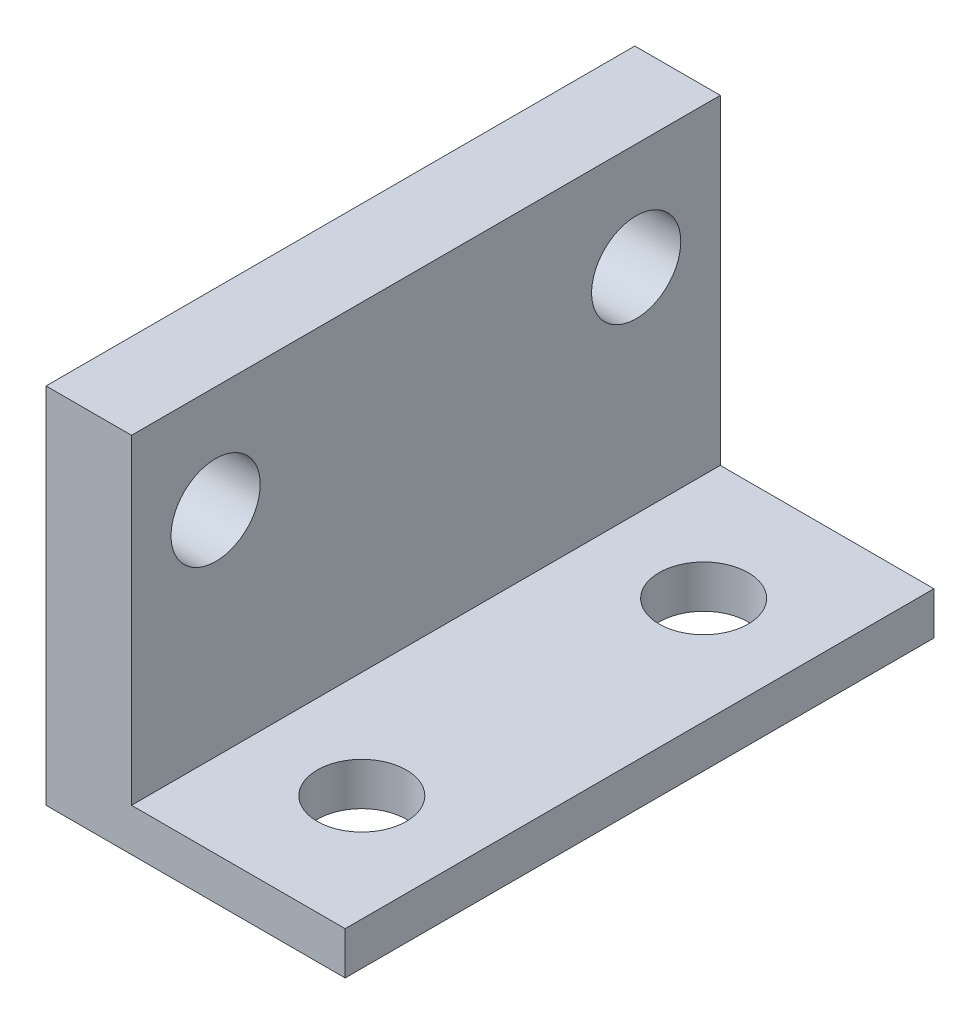
ISO-10303-21;
HEADER;
FILE_DESCRIPTION(('STEP AP214'),'2;1');
FILE_NAME('part.step','',(''),(''),'','','');
FILE_SCHEMA(('AUTOMOTIVE_DESIGN { 1 0 10303 214 1 1 1 1 }'));
ENDSEC;
DATA;
#1=APPLICATION_CONTEXT('core data for automotive mechanical design processes');
#2=APPLICATION_PROTOCOL_DEFINITION('international standard','automotive_design',2000,#1);
#3=PRODUCT_CONTEXT('',#1,'mechanical');
#4=PRODUCT('Part','Part','',(#3));
#5=PRODUCT_RELATED_PRODUCT_CATEGORY('part','',(#4));
#6=PRODUCT_DEFINITION_FORMATION('','',#4);
#7=PRODUCT_DEFINITION_CONTEXT('part definition',#1,'design');
#8=PRODUCT_DEFINITION('design','',#6,#7);
#9=PRODUCT_DEFINITION_SHAPE('','',#8);
#10=(LENGTH_UNIT() NAMED_UNIT(*) SI_UNIT(.MILLI.,.METRE.));
#11=(NAMED_UNIT(*) PLANE_ANGLE_UNIT() SI_UNIT($,.RADIAN.));
#12=(NAMED_UNIT(*) SI_UNIT($,.STERADIAN.) SOLID_ANGLE_UNIT());
#13=UNCERTAINTY_MEASURE_WITH_UNIT(LENGTH_MEASURE(1.E-05),#10,'distance_accuracy_value','');
#14=(GEOMETRIC_REPRESENTATION_CONTEXT(3) GLOBAL_UNCERTAINTY_ASSIGNED_CONTEXT((#13)) GLOBAL_UNIT_ASSIGNED_CONTEXT((#10,
#11,#12)) REPRESENTATION_CONTEXT('',''));
#15=CARTESIAN_POINT('',(0.,0.,0.));
#16=DIRECTION('',(0.,0.,1.));
#17=DIRECTION('',(1.,0.,0.));
#18=AXIS2_PLACEMENT_3D('',#15,#16,#17);
#19=CARTESIAN_POINT('',(0.,0.,35.));
#20=DIRECTION('',(0.,0.,1.));
#21=DIRECTION('',(1.,0.,0.));
#22=AXIS2_PLACEMENT_3D('',#19,#20,#21);
#23=PLANE('',#22);
#24=DIRECTION('',(1.,0.,0.));
#25=VECTOR('',#24,1.);
#26=CARTESIAN_POINT('',(0.,21.59,35.));
#27=LINE('',#26,#25);
#28=CARTESIAN_POINT('',(0.,21.59,35.));
#29=VERTEX_POINT('',#28);
#30=CARTESIAN_POINT('',(5.08,21.59,35.));
#31=VERTEX_POINT('',#30);
#32=EDGE_CURVE('E94',#29,#31,#27,.T.);
#33=ORIENTED_EDGE('',*,*,#32,.F.);
#34=DIRECTION('',(0.,1.,0.));
#35=VECTOR('',#34,1.);
#36=CARTESIAN_POINT('',(0.,2.54,35.));
#37=LINE('',#36,#35);
#38=CARTESIAN_POINT('',(0.,0.,35.));
#39=VERTEX_POINT('',#38);
#40=EDGE_CURVE('E139',#39,#29,#37,.T.);
#41=ORIENTED_EDGE('',*,*,#40,.F.);
#42=DIRECTION('',(1.,0.,0.));
#43=VECTOR('',#42,1.);
#44=CARTESIAN_POINT('',(0.,0.,35.));
#45=LINE('',#44,#43);
#46=CARTESIAN_POINT('',(17.78,0.,35.));
#47=VERTEX_POINT('',#46);
#48=EDGE_CURVE('E98',#39,#47,#45,.T.);
#49=ORIENTED_EDGE('',*,*,#48,.T.);
#50=DIRECTION('',(0.,1.,0.));
#51=VECTOR('',#50,1.);
#52=CARTESIAN_POINT('',(17.78,0.,35.));
#53=LINE('',#52,#51);
#54=CARTESIAN_POINT('',(17.78,2.54,35.));
#55=VERTEX_POINT('',#54);
#56=EDGE_CURVE('E108',#47,#55,#53,.T.);
#57=ORIENTED_EDGE('',*,*,#56,.T.);
#58=DIRECTION('',(1.,0.,0.));
#59=VECTOR('',#58,1.);
#60=CARTESIAN_POINT('',(0.,2.54,35.));
#61=LINE('',#60,#59);
#62=CARTESIAN_POINT('',(5.08,2.54,35.));
#63=VERTEX_POINT('',#62);
#64=EDGE_CURVE('E106',#63,#55,#61,.T.);
#65=ORIENTED_EDGE('',*,*,#64,.F.);
#66=DIRECTION('',(0.,1.,0.));
#67=VECTOR('',#66,1.);
#68=CARTESIAN_POINT('',(5.08,2.54,35.));
#69=LINE('',#68,#67);
#70=EDGE_CURVE('E136',#63,#31,#69,.T.);
#71=ORIENTED_EDGE('',*,*,#70,.T.);
#72=EDGE_LOOP('',(#33,#41,#49,#57,#65,#71));
#73=FACE_BOUND('',#72,.T.);
#74=ADVANCED_FACE('F32',(#73),#23,.T.);
#75=CARTESIAN_POINT('',(0.,21.59,35.));
#76=DIRECTION('',(0.,1.,0.));
#77=DIRECTION('',(0.,0.,1.));
#78=AXIS2_PLACEMENT_3D('',#75,#76,#77);
#79=PLANE('',#78);
#80=DIRECTION('',(1.,0.,0.));
#81=VECTOR('',#80,1.);
#82=CARTESIAN_POINT('',(0.,21.59,0.));
#83=LINE('',#82,#81);
#84=CARTESIAN_POINT('',(0.,21.59,0.));
#85=VERTEX_POINT('',#84);
#86=CARTESIAN_POINT('',(5.08,21.59,0.));
#87=VERTEX_POINT('',#86);
#88=EDGE_CURVE('E99',#85,#87,#83,.T.);
#89=ORIENTED_EDGE('',*,*,#88,.F.);
#90=DIRECTION('',(0.,0.,-1.));
#91=VECTOR('',#90,1.);
#92=CARTESIAN_POINT('',(0.,21.59,35.));
#93=LINE('',#92,#91);
#94=EDGE_CURVE('E11',#29,#85,#93,.T.);
#95=ORIENTED_EDGE('',*,*,#94,.F.);
#96=ORIENTED_EDGE('',*,*,#32,.T.);
#97=DIRECTION('',(0.,0.,-1.));
#98=VECTOR('',#97,1.);
#99=CARTESIAN_POINT('',(5.08,21.59,35.));
#100=LINE('',#99,#98);
#101=EDGE_CURVE('E141',#31,#87,#100,.T.);
#102=ORIENTED_EDGE('',*,*,#101,.T.);
#103=EDGE_LOOP('',(#89,#95,#96,#102));
#104=FACE_BOUND('',#103,.T.);
#105=ADVANCED_FACE('F147',(#104),#79,.T.);
#106=CARTESIAN_POINT('',(0.,0.,0.));
#107=DIRECTION('',(0.,0.,1.));
#108=DIRECTION('',(1.,0.,0.));
#109=AXIS2_PLACEMENT_3D('',#106,#107,#108);
#110=PLANE('',#109);
#111=ORIENTED_EDGE('',*,*,#88,.T.);
#112=DIRECTION('',(0.,1.,0.));
#113=VECTOR('',#112,1.);
#114=CARTESIAN_POINT('',(5.08,2.54,0.));
#115=LINE('',#114,#113);
#116=CARTESIAN_POINT('',(5.08,2.54,0.));
#117=VERTEX_POINT('',#116);
#118=EDGE_CURVE('E95',#117,#87,#115,.T.);
#119=ORIENTED_EDGE('',*,*,#118,.F.);
#120=DIRECTION('',(1.,0.,0.));
#121=VECTOR('',#120,1.);
#122=CARTESIAN_POINT('',(0.,2.54,0.));
#123=LINE('',#122,#121);
#124=CARTESIAN_POINT('',(17.78,2.54,0.));
#125=VERTEX_POINT('',#124);
#126=EDGE_CURVE('E110',#117,#125,#123,.T.);
#127=ORIENTED_EDGE('',*,*,#126,.T.);
#128=DIRECTION('',(0.,1.,0.));
#129=VECTOR('',#128,1.);
#130=CARTESIAN_POINT('',(17.78,0.,0.));
#131=LINE('',#130,#129);
#132=CARTESIAN_POINT('',(17.78,0.,0.));
#133=VERTEX_POINT('',#132);
#134=EDGE_CURVE('E105',#133,#125,#131,.T.);
#135=ORIENTED_EDGE('',*,*,#134,.F.);
#136=DIRECTION('',(1.,0.,0.));
#137=VECTOR('',#136,1.);
#138=CARTESIAN_POINT('',(0.,0.,0.));
#139=LINE('',#138,#137);
#140=CARTESIAN_POINT('',(0.,0.,0.));
#141=VERTEX_POINT('',#140);
#142=EDGE_CURVE('E81',#141,#133,#139,.T.);
#143=ORIENTED_EDGE('',*,*,#142,.F.);
#144=DIRECTION('',(0.,1.,0.));
#145=VECTOR('',#144,1.);
#146=CARTESIAN_POINT('',(0.,2.54,0.));
#147=LINE('',#146,#145);
#148=EDGE_CURVE('E87',#141,#85,#147,.T.);
#149=ORIENTED_EDGE('',*,*,#148,.T.);
#150=EDGE_LOOP('',(#111,#119,#127,#135,#143,#149));
#151=FACE_BOUND('',#150,.T.);
#152=ADVANCED_FACE('F103',(#151),#110,.F.);
#153=CARTESIAN_POINT('',(5.08,2.54,35.));
#154=DIRECTION('',(-1.,0.,0.));
#155=DIRECTION('',(0.,0.,1.));
#156=AXIS2_PLACEMENT_3D('',#153,#154,#155);
#157=PLANE('',#156);
#158=CARTESIAN_POINT('',(5.08,15.24,30.));
#159=DIRECTION('',(1.,0.,0.));
#160=DIRECTION('',(0.,0.,-1.));
#161=AXIS2_PLACEMENT_3D('',#158,#159,#160);
#162=CIRCLE('',#161,2.65);
#163=CARTESIAN_POINT('',(5.08,15.24,27.35));
#164=VERTEX_POINT('',#163);
#165=EDGE_CURVE('E188',#164,#164,#162,.T.);
#166=ORIENTED_EDGE('',*,*,#165,.F.);
#167=EDGE_LOOP('',(#166));
#168=FACE_BOUND('',#167,.T.);
#169=CARTESIAN_POINT('',(5.08,15.24,5.));
#170=DIRECTION('',(1.,0.,0.));
#171=DIRECTION('',(0.,0.,-1.));
#172=AXIS2_PLACEMENT_3D('',#169,#170,#171);
#173=CIRCLE('',#172,2.65);
#174=CARTESIAN_POINT('',(5.08,15.24,2.35));
#175=VERTEX_POINT('',#174);
#176=EDGE_CURVE('E126',#175,#175,#173,.T.);
#177=ORIENTED_EDGE('',*,*,#176,.F.);
#178=EDGE_LOOP('',(#177));
#179=FACE_BOUND('',#178,.T.);
#180=ORIENTED_EDGE('',*,*,#118,.T.);
#181=ORIENTED_EDGE('',*,*,#101,.F.);
#182=ORIENTED_EDGE('',*,*,#70,.F.);
#183=DIRECTION('',(0.,0.,-1.));
#184=VECTOR('',#183,1.);
#185=CARTESIAN_POINT('',(5.08,2.54,35.));
#186=LINE('',#185,#184);
#187=EDGE_CURVE('E42',#63,#117,#186,.T.);
#188=ORIENTED_EDGE('',*,*,#187,.T.);
#189=EDGE_LOOP('',(#180,#181,#182,#188));
#190=FACE_BOUND('',#189,.T.);
#191=ADVANCED_FACE('F150',(#168,#179,#190),#157,.F.);
#192=CARTESIAN_POINT('',(0.,2.54,35.));
#193=DIRECTION('',(-1.,0.,0.));
#194=DIRECTION('',(0.,0.,1.));
#195=AXIS2_PLACEMENT_3D('',#192,#193,#194);
#196=PLANE('',#195);
#197=CARTESIAN_POINT('',(0.,15.24,30.));
#198=DIRECTION('',(1.,0.,0.));
#199=DIRECTION('',(0.,0.,-1.));
#200=AXIS2_PLACEMENT_3D('',#197,#198,#199);
#201=CIRCLE('',#200,2.65);
#202=CARTESIAN_POINT('',(0.,15.24,27.35));
#203=VERTEX_POINT('',#202);
#204=EDGE_CURVE('E131',#203,#203,#201,.T.);
#205=ORIENTED_EDGE('',*,*,#204,.T.);
#206=EDGE_LOOP('',(#205));
#207=FACE_BOUND('',#206,.T.);
#208=CARTESIAN_POINT('',(0.,15.24,5.));
#209=DIRECTION('',(1.,0.,0.));
#210=DIRECTION('',(0.,0.,-1.));
#211=AXIS2_PLACEMENT_3D('',#208,#209,#210);
#212=CIRCLE('',#211,2.65);
#213=CARTESIAN_POINT('',(0.,15.24,2.35));
#214=VERTEX_POINT('',#213);
#215=EDGE_CURVE('E123',#214,#214,#212,.T.);
#216=ORIENTED_EDGE('',*,*,#215,.T.);
#217=EDGE_LOOP('',(#216));
#218=FACE_BOUND('',#217,.T.);
#219=ORIENTED_EDGE('',*,*,#148,.F.);
#220=DIRECTION('',(0.,0.,-1.));
#221=VECTOR('',#220,1.);
#222=CARTESIAN_POINT('',(0.,0.,35.));
#223=LINE('',#222,#221);
#224=EDGE_CURVE('E90',#39,#141,#223,.T.);
#225=ORIENTED_EDGE('',*,*,#224,.F.);
#226=ORIENTED_EDGE('',*,*,#40,.T.);
#227=ORIENTED_EDGE('',*,*,#94,.T.);
#228=EDGE_LOOP('',(#219,#225,#226,#227));
#229=FACE_BOUND('',#228,.T.);
#230=ADVANCED_FACE('F88',(#207,#218,#229),#196,.T.);
#231=CARTESIAN_POINT('',(0.,0.,35.));
#232=DIRECTION('',(0.,1.,0.));
#233=DIRECTION('',(0.,0.,1.));
#234=AXIS2_PLACEMENT_3D('',#231,#232,#233);
#235=PLANE('',#234);
#236=CARTESIAN_POINT('',(11.43,0.,27.66));
#237=DIRECTION('',(0.,1.,0.));
#238=DIRECTION('',(0.,0.,1.));
#239=AXIS2_PLACEMENT_3D('',#236,#237,#238);
#240=CIRCLE('',#239,2.65);
#241=CARTESIAN_POINT('',(11.43,0.,30.31));
#242=VERTEX_POINT('',#241);
#243=EDGE_CURVE('E201',#242,#242,#240,.T.);
#244=ORIENTED_EDGE('',*,*,#243,.T.);
#245=EDGE_LOOP('',(#244));
#246=FACE_BOUND('',#245,.T.);
#247=CARTESIAN_POINT('',(11.43,0.,7.34));
#248=DIRECTION('',(0.,1.,0.));
#249=DIRECTION('',(0.,0.,1.));
#250=AXIS2_PLACEMENT_3D('',#247,#248,#249);
#251=CIRCLE('',#250,2.65);
#252=CARTESIAN_POINT('',(11.43,0.,9.99));
#253=VERTEX_POINT('',#252);
#254=EDGE_CURVE('E192',#253,#253,#251,.T.);
#255=ORIENTED_EDGE('',*,*,#254,.T.);
#256=EDGE_LOOP('',(#255));
#257=FACE_BOUND('',#256,.T.);
#258=ORIENTED_EDGE('',*,*,#142,.T.);
#259=DIRECTION('',(0.,0.,-1.));
#260=VECTOR('',#259,1.);
#261=CARTESIAN_POINT('',(17.78,0.,35.));
#262=LINE('',#261,#260);
#263=EDGE_CURVE('E100',#47,#133,#262,.T.);
#264=ORIENTED_EDGE('',*,*,#263,.F.);
#265=ORIENTED_EDGE('',*,*,#48,.F.);
#266=ORIENTED_EDGE('',*,*,#224,.T.);
#267=EDGE_LOOP('',(#258,#264,#265,#266));
#268=FACE_BOUND('',#267,.T.);
#269=ADVANCED_FACE('F97',(#246,#257,#268),#235,.F.);
#270=CARTESIAN_POINT('',(17.78,0.,35.));
#271=DIRECTION('',(-1.,0.,0.));
#272=DIRECTION('',(0.,0.,1.));
#273=AXIS2_PLACEMENT_3D('',#270,#271,#272);
#274=PLANE('',#273);
#275=ORIENTED_EDGE('',*,*,#134,.T.);
#276=DIRECTION('',(0.,0.,-1.));
#277=VECTOR('',#276,1.);
#278=CARTESIAN_POINT('',(17.78,2.54,35.));
#279=LINE('',#278,#277);
#280=EDGE_CURVE('E36',#55,#125,#279,.T.);
#281=ORIENTED_EDGE('',*,*,#280,.F.);
#282=ORIENTED_EDGE('',*,*,#56,.F.);
#283=ORIENTED_EDGE('',*,*,#263,.T.);
#284=EDGE_LOOP('',(#275,#281,#282,#283));
#285=FACE_BOUND('',#284,.T.);
#286=ADVANCED_FACE('F154',(#285),#274,.F.);
#287=CARTESIAN_POINT('',(0.,2.54,35.));
#288=DIRECTION('',(0.,1.,0.));
#289=DIRECTION('',(0.,0.,1.));
#290=AXIS2_PLACEMENT_3D('',#287,#288,#289);
#291=PLANE('',#290);
#292=CARTESIAN_POINT('',(11.43,2.54,27.66));
#293=DIRECTION('',(0.,1.,0.));
#294=DIRECTION('',(0.,0.,1.));
#295=AXIS2_PLACEMENT_3D('',#292,#293,#294);
#296=CIRCLE('',#295,2.64999999999999);
#297=CARTESIAN_POINT('',(11.43,2.54,30.31));
#298=VERTEX_POINT('',#297);
#299=EDGE_CURVE('E204',#298,#298,#296,.T.);
#300=ORIENTED_EDGE('',*,*,#299,.F.);
#301=EDGE_LOOP('',(#300));
#302=FACE_BOUND('',#301,.T.);
#303=CARTESIAN_POINT('',(11.43,2.54,7.34));
#304=DIRECTION('',(0.,1.,0.));
#305=DIRECTION('',(0.,0.,1.));
#306=AXIS2_PLACEMENT_3D('',#303,#304,#305);
#307=CIRCLE('',#306,2.64999999999999);
#308=CARTESIAN_POINT('',(11.43,2.54,9.98999999999999));
#309=VERTEX_POINT('',#308);
#310=EDGE_CURVE('E196',#309,#309,#307,.T.);
#311=ORIENTED_EDGE('',*,*,#310,.F.);
#312=EDGE_LOOP('',(#311));
#313=FACE_BOUND('',#312,.T.);
#314=ORIENTED_EDGE('',*,*,#187,.F.);
#315=ORIENTED_EDGE('',*,*,#64,.T.);
#316=ORIENTED_EDGE('',*,*,#280,.T.);
#317=ORIENTED_EDGE('',*,*,#126,.F.);
#318=EDGE_LOOP('',(#314,#315,#316,#317));
#319=FACE_BOUND('',#318,.T.);
#320=ADVANCED_FACE('F34',(#302,#313,#319),#291,.T.);
#321=CARTESIAN_POINT('',(5.08,15.24,5.));
#322=DIRECTION('',(1.,0.,0.));
#323=DIRECTION('',(0.,0.,-1.));
#324=AXIS2_PLACEMENT_3D('',#321,#322,#323);
#325=CYLINDRICAL_SURFACE('',#324,2.65);
#326=ORIENTED_EDGE('',*,*,#215,.F.);
#327=EDGE_LOOP('',(#326));
#328=FACE_BOUND('',#327,.T.);
#329=ORIENTED_EDGE('',*,*,#176,.T.);
#330=EDGE_LOOP('',(#329));
#331=FACE_BOUND('',#330,.T.);
#332=ADVANCED_FACE('F153',(#328,#331),#325,.F.);
#333=CARTESIAN_POINT('',(5.08,15.24,30.));
#334=DIRECTION('',(1.,0.,0.));
#335=DIRECTION('',(0.,0.,-1.));
#336=AXIS2_PLACEMENT_3D('',#333,#334,#335);
#337=CYLINDRICAL_SURFACE('',#336,2.65);
#338=ORIENTED_EDGE('',*,*,#204,.F.);
#339=EDGE_LOOP('',(#338));
#340=FACE_BOUND('',#339,.T.);
#341=ORIENTED_EDGE('',*,*,#165,.T.);
#342=EDGE_LOOP('',(#341));
#343=FACE_BOUND('',#342,.T.);
#344=ADVANCED_FACE('F160',(#340,#343),#337,.F.);
#345=CARTESIAN_POINT('',(11.43,2.54,7.34));
#346=DIRECTION('',(0.,1.,0.));
#347=DIRECTION('',(0.,0.,1.));
#348=AXIS2_PLACEMENT_3D('',#345,#346,#347);
#349=CYLINDRICAL_SURFACE('',#348,2.64999999999999);
#350=ORIENTED_EDGE('',*,*,#254,.F.);
#351=EDGE_LOOP('',(#350));
#352=FACE_BOUND('',#351,.T.);
#353=ORIENTED_EDGE('',*,*,#310,.T.);
#354=EDGE_LOOP('',(#353));
#355=FACE_BOUND('',#354,.T.);
#356=ADVANCED_FACE('F209',(#352,#355),#349,.F.);
#357=CARTESIAN_POINT('',(11.43,2.54,27.66));
#358=DIRECTION('',(0.,1.,0.));
#359=DIRECTION('',(0.,0.,1.));
#360=AXIS2_PLACEMENT_3D('',#357,#358,#359);
#361=CYLINDRICAL_SURFACE('',#360,2.64999999999999);
#362=ORIENTED_EDGE('',*,*,#243,.F.);
#363=EDGE_LOOP('',(#362));
#364=FACE_BOUND('',#363,.T.);
#365=ORIENTED_EDGE('',*,*,#299,.T.);
#366=EDGE_LOOP('',(#365));
#367=FACE_BOUND('',#366,.T.);
#368=ADVANCED_FACE('F207',(#364,#367),#361,.F.);
#369=CLOSED_SHELL('',(#74,#105,#152,#191,#230,#269,#286,#320,#332,#344,#356,#368));
#370=MANIFOLD_SOLID_BREP('B2',#369);
#371=ADVANCED_BREP_SHAPE_REPRESENTATION('',(#18,#370),#14);
#372=SHAPE_DEFINITION_REPRESENTATION(#9,#371);
ENDSEC;
END-ISO-10303-21;
